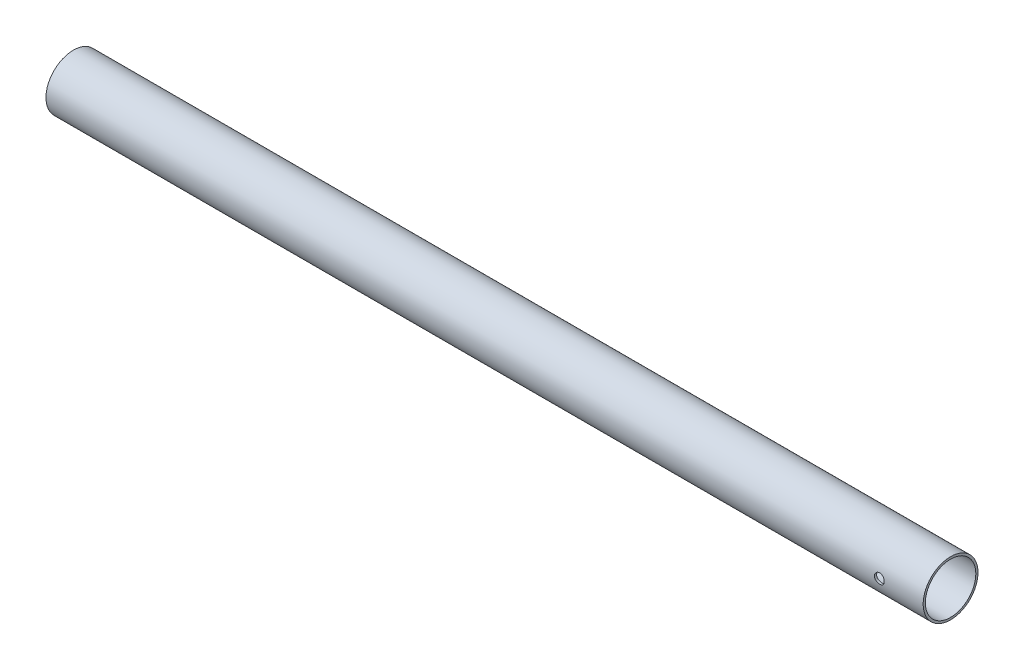
ISO-10303-21;
HEADER;
FILE_DESCRIPTION(('STEP AP214'),'2;1');
FILE_NAME('part.step','',(''),(''),'','','');
FILE_SCHEMA(('AUTOMOTIVE_DESIGN { 1 0 10303 214 1 1 1 1 }'));
ENDSEC;
DATA;
#1=APPLICATION_CONTEXT('core data for automotive mechanical design processes');
#2=APPLICATION_PROTOCOL_DEFINITION('international standard','automotive_design',2000,#1);
#3=PRODUCT_CONTEXT('',#1,'mechanical');
#4=PRODUCT('Part','Part','',(#3));
#5=PRODUCT_RELATED_PRODUCT_CATEGORY('part','',(#4));
#6=PRODUCT_DEFINITION_FORMATION('','',#4);
#7=PRODUCT_DEFINITION_CONTEXT('part definition',#1,'design');
#8=PRODUCT_DEFINITION('design','',#6,#7);
#9=PRODUCT_DEFINITION_SHAPE('','',#8);
#10=(LENGTH_UNIT() NAMED_UNIT(*) SI_UNIT(.MILLI.,.METRE.));
#11=(NAMED_UNIT(*) PLANE_ANGLE_UNIT() SI_UNIT($,.RADIAN.));
#12=(NAMED_UNIT(*) SI_UNIT($,.STERADIAN.) SOLID_ANGLE_UNIT());
#13=UNCERTAINTY_MEASURE_WITH_UNIT(LENGTH_MEASURE(1.E-05),#10,'distance_accuracy_value','');
#14=(GEOMETRIC_REPRESENTATION_CONTEXT(3) GLOBAL_UNCERTAINTY_ASSIGNED_CONTEXT((#13)) GLOBAL_UNIT_ASSIGNED_CONTEXT((#10,
#11,#12)) REPRESENTATION_CONTEXT('',''));
#15=CARTESIAN_POINT('',(0.,0.,0.));
#16=DIRECTION('',(0.,0.,1.));
#17=DIRECTION('',(1.,0.,0.));
#18=AXIS2_PLACEMENT_3D('',#15,#16,#17);
#19=CARTESIAN_POINT('',(400.,0.,0.));
#20=DIRECTION('',(1.,0.,0.));
#21=DIRECTION('',(0.,0.,-1.));
#22=AXIS2_PLACEMENT_3D('',#19,#20,#21);
#23=PLANE('',#22);
#24=CARTESIAN_POINT('',(400.,0.,0.));
#25=DIRECTION('',(1.,0.,0.));
#26=DIRECTION('',(0.,0.,-1.));
#27=AXIS2_PLACEMENT_3D('',#24,#25,#26);
#28=CIRCLE('',#27,12.5);
#29=CARTESIAN_POINT('',(400.,0.,-12.5));
#30=VERTEX_POINT('',#29);
#31=EDGE_CURVE('E51',#30,#30,#28,.T.);
#32=ORIENTED_EDGE('',*,*,#31,.T.);
#33=EDGE_LOOP('',(#32));
#34=FACE_BOUND('',#33,.T.);
#35=CARTESIAN_POINT('',(400.,0.,0.));
#36=DIRECTION('',(1.,0.,0.));
#37=DIRECTION('',(0.,0.,-1.));
#38=AXIS2_PLACEMENT_3D('',#35,#36,#37);
#39=CIRCLE('',#38,11.5);
#40=CARTESIAN_POINT('',(400.,0.,-11.5));
#41=VERTEX_POINT('',#40);
#42=EDGE_CURVE('E87',#41,#41,#39,.T.);
#43=ORIENTED_EDGE('',*,*,#42,.F.);
#44=EDGE_LOOP('',(#43));
#45=FACE_BOUND('',#44,.T.);
#46=ADVANCED_FACE('F35',(#34,#45),#23,.T.);
#47=CARTESIAN_POINT('',(0.,0.,0.));
#48=DIRECTION('',(1.,0.,0.));
#49=DIRECTION('',(0.,0.,-1.));
#50=AXIS2_PLACEMENT_3D('',#47,#48,#49);
#51=PLANE('',#50);
#52=CARTESIAN_POINT('',(0.,0.,0.));
#53=DIRECTION('',(1.,0.,0.));
#54=DIRECTION('',(0.,0.,-1.));
#55=AXIS2_PLACEMENT_3D('',#52,#53,#54);
#56=CIRCLE('',#55,12.5);
#57=CARTESIAN_POINT('',(0.,0.,-12.5));
#58=VERTEX_POINT('',#57);
#59=EDGE_CURVE('E55',#58,#58,#56,.T.);
#60=ORIENTED_EDGE('',*,*,#59,.F.);
#61=EDGE_LOOP('',(#60));
#62=FACE_BOUND('',#61,.T.);
#63=CARTESIAN_POINT('',(0.,0.,0.));
#64=DIRECTION('',(1.,0.,0.));
#65=DIRECTION('',(0.,0.,-1.));
#66=AXIS2_PLACEMENT_3D('',#63,#64,#65);
#67=CIRCLE('',#66,11.5);
#68=CARTESIAN_POINT('',(0.,0.,-11.5));
#69=VERTEX_POINT('',#68);
#70=EDGE_CURVE('E86',#69,#69,#67,.T.);
#71=ORIENTED_EDGE('',*,*,#70,.T.);
#72=EDGE_LOOP('',(#71));
#73=FACE_BOUND('',#72,.T.);
#74=ADVANCED_FACE('F93',(#62,#73),#51,.F.);
#75=CARTESIAN_POINT('',(400.,0.,0.));
#76=DIRECTION('',(-1.,0.,0.));
#77=DIRECTION('',(0.,0.,1.));
#78=AXIS2_PLACEMENT_3D('',#75,#76,#77);
#79=CYLINDRICAL_SURFACE('',#78,12.5);
#80=CARTESIAN_POINT('',(377.75,0.,12.5));
#81=CARTESIAN_POINT('',(377.750004881026,0.125298681986797,12.4999977674912));
#82=CARTESIAN_POINT('',(377.760501872311,0.25066193845859,12.4980965123329));
#83=CARTESIAN_POINT('',(377.802189035155,0.497861978665398,12.4906952154093));
#84=CARTESIAN_POINT('',(377.833397255,0.61969558985192,12.4851920348931));
#85=CARTESIAN_POINT('',(377.915525418449,0.856224998081099,12.4712031058359));
#86=CARTESIAN_POINT('',(377.966428182124,0.970926915296232,12.4627199573701));
#87=CARTESIAN_POINT('',(378.086453098236,1.19015008759337,12.4436998211695));
#88=CARTESIAN_POINT('',(378.155573550489,1.2946722914612,12.4331630251171));
#89=CARTESIAN_POINT('',(378.310885156238,1.49173892052009,12.4110699839934));
#90=CARTESIAN_POINT('',(378.397238838549,1.58415425002094,12.3995046634254));
#91=CARTESIAN_POINT('',(378.584215919306,1.75326760244445,12.3767261918013));
#92=CARTESIAN_POINT('',(378.684840293998,1.82996454920803,12.3655130649026));
#93=CARTESIAN_POINT('',(378.898405310083,1.96599369496261,12.3446205144066));
#94=CARTESIAN_POINT('',(379.011429978869,2.02519592811085,12.3349528032239));
#95=CARTESIAN_POINT('',(379.246023631375,2.12372345891957,12.3183728941507));
#96=CARTESIAN_POINT('',(379.367591937552,2.16305033075057,12.3114604780441));
#97=CARTESIAN_POINT('',(379.614445307403,2.22029926603348,12.3012648124572));
#98=CARTESIAN_POINT('',(379.739676747985,2.23844564821779,12.2979435578795));
#99=CARTESIAN_POINT('',(379.991447497663,2.25351448396807,12.2951915456139));
#100=CARTESIAN_POINT('',(380.117986697894,2.25043869020338,12.2957604666492));
#101=CARTESIAN_POINT('',(380.367164785449,2.22333268298985,12.3006898852657));
#102=CARTESIAN_POINT('',(380.489832336658,2.19955638565589,12.3050044364384));
#103=CARTESIAN_POINT('',(380.729408435276,2.13212365102783,12.316866899555));
#104=CARTESIAN_POINT('',(380.846316755245,2.08846642930113,12.3244149390804));
#105=CARTESIAN_POINT('',(381.071805143122,1.98225941180058,12.3419425352291));
#106=CARTESIAN_POINT('',(381.180335335255,1.9196060058232,12.3519353671767));
#107=CARTESIAN_POINT('',(381.385438003142,1.77725850028801,12.3732176723876));
#108=CARTESIAN_POINT('',(381.482009356283,1.69756280282898,12.3845072671906));
#109=CARTESIAN_POINT('',(381.661921136897,1.52201857930322,12.4073118839222));
#110=CARTESIAN_POINT('',(381.745049436327,1.42595261440166,12.4188278010628));
#111=CARTESIAN_POINT('',(381.894040903348,1.22112530278979,12.4406367648775));
#112=CARTESIAN_POINT('',(381.959903922596,1.11236384701144,12.4509298010443));
#113=CARTESIAN_POINT('',(382.072521985629,0.885019768870827,12.4691516328429));
#114=CARTESIAN_POINT('',(382.119256208455,0.766426612967708,12.4770778497592));
#115=CARTESIAN_POINT('',(382.192082193012,0.522899253039724,12.4896527895691));
#116=CARTESIAN_POINT('',(382.218175973129,0.39796567030335,12.4943018329256));
#117=CARTESIAN_POINT('',(382.248687979903,0.147130108494353,12.4997549324063));
#118=CARTESIAN_POINT('',(382.25339706021,0.0212645934313532,12.5006105787524));
#119=CARTESIAN_POINT('',(382.241784403972,-0.229455861704506,12.4985225341363));
#120=CARTESIAN_POINT('',(382.225463616601,-0.354310847131248,12.4955790146477));
#121=CARTESIAN_POINT('',(382.172496383332,-0.598552524626915,12.4862554255897));
#122=CARTESIAN_POINT('',(382.135995926579,-0.717971900974097,12.4799000484474));
#123=CARTESIAN_POINT('',(382.04386257153,-0.948996285923227,12.4644623821362));
#124=CARTESIAN_POINT('',(381.988228455274,-1.06060079652311,12.4553799193784));
#125=CARTESIAN_POINT('',(381.858754950924,-1.27407696942464,12.4353669796939));
#126=CARTESIAN_POINT('',(381.784736359436,-1.37583823911222,12.4244186663665));
#127=CARTESIAN_POINT('',(381.620838998827,-1.56559958610649,12.4019371582137));
#128=CARTESIAN_POINT('',(381.530958872466,-1.65359848457808,12.3904039133971));
#129=CARTESIAN_POINT('',(381.336577500913,-1.8144322861375,12.3678828600073));
#130=CARTESIAN_POINT('',(381.231911488777,-1.88706941512662,12.3569034068723));
#131=CARTESIAN_POINT('',(381.011692349073,-2.01373073598649,12.3368965881738));
#132=CARTESIAN_POINT('',(380.896139605745,-2.06775558445176,12.327869153752));
#133=CARTESIAN_POINT('',(380.65794816388,-2.15537258854328,12.3128530018575));
#134=CARTESIAN_POINT('',(380.535344792256,-2.18905829167568,12.3068503934841));
#135=CARTESIAN_POINT('',(380.286101320987,-2.23533164183898,12.2985305984642));
#136=CARTESIAN_POINT('',(380.159461638613,-2.24792146258463,12.2962130321129));
#137=CARTESIAN_POINT('',(379.907719026291,-2.25157741279498,12.2955439189313));
#138=CARTESIAN_POINT('',(379.782620668345,-2.24295524222451,12.2971349368514));
#139=CARTESIAN_POINT('',(379.535686889202,-2.20511123815906,12.3039769205597));
#140=CARTESIAN_POINT('',(379.413851452036,-2.17588950549702,12.3092278684327));
#141=CARTESIAN_POINT('',(379.177052107882,-2.09780295588624,12.3227747458695));
#142=CARTESIAN_POINT('',(379.062077622884,-2.0489693244615,12.331065839386));
#143=CARTESIAN_POINT('',(378.841903383332,-1.9330784374378,12.3497626645301));
#144=CARTESIAN_POINT('',(378.736704244324,-1.86602003528115,12.3601685291918));
#145=CARTESIAN_POINT('',(378.537500445622,-1.71448870972005,12.3821021382439));
#146=CARTESIAN_POINT('',(378.443670525958,-1.6297879913884,12.3936433960265));
#147=CARTESIAN_POINT('',(378.271450700472,-1.44585363976477,12.4164438377711));
#148=CARTESIAN_POINT('',(378.193064350056,-1.34661666909395,12.4277029562598));
#149=CARTESIAN_POINT('',(378.05336059235,-1.13545412119437,12.4487784100862));
#150=CARTESIAN_POINT('',(377.992188444119,-1.02343115620965,12.4585821554973));
#151=CARTESIAN_POINT('',(377.889628594984,-0.790561442189736,12.4755196121995));
#152=CARTESIAN_POINT('',(377.848221889639,-0.669723298367009,12.4826558868212));
#153=CARTESIAN_POINT('',(377.794993612026,-0.457071330933689,12.4919609434263));
#154=CARTESIAN_POINT('',(377.778149156143,-0.366517696899414,12.4949589083512));
#155=CARTESIAN_POINT('',(377.755650681845,-0.183987628103353,12.4989792344744));
#156=CARTESIAN_POINT('',(377.749996415691,-0.0920112248856671,12.5000016394097));
#157=CARTESIAN_POINT('',(377.75,0.,12.5));
#158=B_SPLINE_CURVE_WITH_KNOTS('',3,(#80,#81,#82,#83,#84,#85,#86,#87,#88,#89,#90,#91,#92,#93,
#94,#95,#96,#97,#98,#99,#100,#101,#102,#103,#104,#105,#106,#107,#108,#109,#110,#111,#112,#113,
#114,#115,#116,#117,#118,#119,#120,#121,#122,#123,#124,#125,#126,#127,#128,#129,#130,#131,#132,
#133,#134,#135,#136,#137,#138,#139,#140,#141,#142,#143,#144,#145,#146,#147,#148,#149,#150,#151,
#152,#153,#154,#155,#156,#157),.UNSPECIFIED.,.T.,.F.,(4,2,2,2,2,2,2,2,2,2,2,2,2,2,2,2,2,2,2,2,2,
2,2,2,2,2,2,2,2,2,2,2,2,2,2,2,2,2,4),(0.,0.375559617107249,0.751446936801127,1.12700709938377,
1.50253222484551,1.88178230491347,2.26105834167071,2.64308495155377,3.02508129938024,
3.4029941907251,3.78087587186719,4.15418667058527,4.52751220013432,4.90291173817364,
5.27834648947029,5.65922447074247,6.04010572441035,6.42140045723418,6.8026578994535,
7.17871401103883,7.55475315008814,7.92810678591757,8.30148419208372,8.67865469057383,
9.05585747845508,9.43765507111856,9.81943919354212,10.1994536967026,10.5794290408499,
10.9538542714616,11.3282776693095,11.7021080267959,12.0759619081628,12.454980861875,
12.8340869713551,13.2163022265236,13.5981492383499,13.8739419673181,14.149728590447),.UNSPECIFIED.);
#159=CARTESIAN_POINT('',(377.75,0.,12.5));
#160=VERTEX_POINT('',#159);
#161=EDGE_CURVE('E10',#160,#160,#158,.T.);
#162=ORIENTED_EDGE('',*,*,#161,.T.);
#163=EDGE_LOOP('',(#162));
#164=FACE_BOUND('',#163,.T.);
#165=CARTESIAN_POINT('',(377.75,0.,-12.5));
#166=CARTESIAN_POINT('',(377.750004881026,-0.125298681986797,-12.4999977674912));
#167=CARTESIAN_POINT('',(377.760501872311,-0.25066193845859,-12.4980965123329));
#168=CARTESIAN_POINT('',(377.802189035155,-0.497861978665398,-12.4906952154093));
#169=CARTESIAN_POINT('',(377.833397255,-0.61969558985192,-12.4851920348931));
#170=CARTESIAN_POINT('',(377.915525418449,-0.856224998081099,-12.4712031058359));
#171=CARTESIAN_POINT('',(377.966428182124,-0.970926915296232,-12.4627199573701));
#172=CARTESIAN_POINT('',(378.086453098236,-1.19015008759337,-12.4436998211695));
#173=CARTESIAN_POINT('',(378.155573550489,-1.2946722914612,-12.4331630251171));
#174=CARTESIAN_POINT('',(378.310885156238,-1.49173892052009,-12.4110699839934));
#175=CARTESIAN_POINT('',(378.397238838549,-1.58415425002094,-12.3995046634254));
#176=CARTESIAN_POINT('',(378.584215919306,-1.75326760244445,-12.3767261918013));
#177=CARTESIAN_POINT('',(378.684840293998,-1.82996454920803,-12.3655130649026));
#178=CARTESIAN_POINT('',(378.898405310083,-1.96599369496261,-12.3446205144066));
#179=CARTESIAN_POINT('',(379.011429978869,-2.02519592811085,-12.3349528032239));
#180=CARTESIAN_POINT('',(379.246023631375,-2.12372345891957,-12.3183728941507));
#181=CARTESIAN_POINT('',(379.367591937552,-2.16305033075057,-12.3114604780441));
#182=CARTESIAN_POINT('',(379.614445307403,-2.22029926603348,-12.3012648124572));
#183=CARTESIAN_POINT('',(379.739676747985,-2.23844564821779,-12.2979435578795));
#184=CARTESIAN_POINT('',(379.991447497663,-2.25351448396807,-12.2951915456139));
#185=CARTESIAN_POINT('',(380.117986697894,-2.25043869020338,-12.2957604666492));
#186=CARTESIAN_POINT('',(380.367164785449,-2.22333268298985,-12.3006898852657));
#187=CARTESIAN_POINT('',(380.489832336658,-2.19955638565589,-12.3050044364384));
#188=CARTESIAN_POINT('',(380.729408435276,-2.13212365102783,-12.316866899555));
#189=CARTESIAN_POINT('',(380.846316755245,-2.08846642930113,-12.3244149390804));
#190=CARTESIAN_POINT('',(381.071805143122,-1.98225941180058,-12.3419425352291));
#191=CARTESIAN_POINT('',(381.180335335255,-1.9196060058232,-12.3519353671767));
#192=CARTESIAN_POINT('',(381.385438003142,-1.77725850028801,-12.3732176723876));
#193=CARTESIAN_POINT('',(381.482009356283,-1.69756280282898,-12.3845072671906));
#194=CARTESIAN_POINT('',(381.661921136897,-1.52201857930322,-12.4073118839222));
#195=CARTESIAN_POINT('',(381.745049436327,-1.42595261440166,-12.4188278010628));
#196=CARTESIAN_POINT('',(381.894040903348,-1.22112530278979,-12.4406367648775));
#197=CARTESIAN_POINT('',(381.959903922596,-1.11236384701144,-12.4509298010443));
#198=CARTESIAN_POINT('',(382.072521985629,-0.885019768870827,-12.4691516328429));
#199=CARTESIAN_POINT('',(382.119256208455,-0.766426612967708,-12.4770778497592));
#200=CARTESIAN_POINT('',(382.192082193012,-0.522899253039724,-12.4896527895691));
#201=CARTESIAN_POINT('',(382.218175973129,-0.39796567030335,-12.4943018329256));
#202=CARTESIAN_POINT('',(382.248687979903,-0.147130108494353,-12.4997549324063));
#203=CARTESIAN_POINT('',(382.25339706021,-0.0212645934313519,-12.5006105787524));
#204=CARTESIAN_POINT('',(382.241784403972,0.229455861704507,-12.4985225341363));
#205=CARTESIAN_POINT('',(382.225463616601,0.354310847131248,-12.4955790146477));
#206=CARTESIAN_POINT('',(382.172496383332,0.598552524626914,-12.4862554255897));
#207=CARTESIAN_POINT('',(382.135995926579,0.717971900974096,-12.4799000484474));
#208=CARTESIAN_POINT('',(382.04386257153,0.948996285923226,-12.4644623821362));
#209=CARTESIAN_POINT('',(381.988228455274,1.06060079652311,-12.4553799193784));
#210=CARTESIAN_POINT('',(381.858754950924,1.27407696942464,-12.4353669796939));
#211=CARTESIAN_POINT('',(381.784736359436,1.37583823911222,-12.4244186663665));
#212=CARTESIAN_POINT('',(381.620838998827,1.56559958610649,-12.4019371582137));
#213=CARTESIAN_POINT('',(381.530958872466,1.65359848457808,-12.3904039133971));
#214=CARTESIAN_POINT('',(381.336577500913,1.8144322861375,-12.3678828600073));
#215=CARTESIAN_POINT('',(381.231911488777,1.88706941512662,-12.3569034068723));
#216=CARTESIAN_POINT('',(381.011692349073,2.01373073598649,-12.3368965881738));
#217=CARTESIAN_POINT('',(380.896139605745,2.06775558445176,-12.327869153752));
#218=CARTESIAN_POINT('',(380.65794816388,2.15537258854328,-12.3128530018575));
#219=CARTESIAN_POINT('',(380.535344792256,2.18905829167568,-12.3068503934841));
#220=CARTESIAN_POINT('',(380.286101320987,2.23533164183898,-12.2985305984642));
#221=CARTESIAN_POINT('',(380.159461638613,2.24792146258463,-12.2962130321129));
#222=CARTESIAN_POINT('',(379.907719026291,2.25157741279498,-12.2955439189313));
#223=CARTESIAN_POINT('',(379.782620668345,2.24295524222451,-12.2971349368514));
#224=CARTESIAN_POINT('',(379.535686889202,2.20511123815908,-12.3039769205597));
#225=CARTESIAN_POINT('',(379.413851452036,2.17588950549703,-12.3092278684327));
#226=CARTESIAN_POINT('',(379.177052107882,2.09780295588624,-12.3227747458695));
#227=CARTESIAN_POINT('',(379.062077622884,2.0489693244615,-12.331065839386));
#228=CARTESIAN_POINT('',(378.841903383332,1.9330784374378,-12.3497626645301));
#229=CARTESIAN_POINT('',(378.736704244324,1.86602003528115,-12.3601685291918));
#230=CARTESIAN_POINT('',(378.537500445622,1.71448870972005,-12.3821021382439));
#231=CARTESIAN_POINT('',(378.443670525958,1.6297879913884,-12.3936433960265));
#232=CARTESIAN_POINT('',(378.271450700472,1.44585363976477,-12.4164438377711));
#233=CARTESIAN_POINT('',(378.193064350056,1.34661666909395,-12.4277029562598));
#234=CARTESIAN_POINT('',(378.05336059235,1.13545412119435,-12.4487784100862));
#235=CARTESIAN_POINT('',(377.992188444119,1.02343115620963,-12.4585821554973));
#236=CARTESIAN_POINT('',(377.889628594984,0.790561442189713,-12.4755196121995));
#237=CARTESIAN_POINT('',(377.848221889639,0.669723298366994,-12.4826558868212));
#238=CARTESIAN_POINT('',(377.794993612026,0.457071330933687,-12.4919609434263));
#239=CARTESIAN_POINT('',(377.778149156143,0.366517696899413,-12.4949589083512));
#240=CARTESIAN_POINT('',(377.755650681845,0.183987628103352,-12.4989792344744));
#241=CARTESIAN_POINT('',(377.749996415691,0.0920112248856668,-12.5000016394097));
#242=CARTESIAN_POINT('',(377.75,0.,-12.5));
#243=B_SPLINE_CURVE_WITH_KNOTS('',3,(#165,#166,#167,#168,#169,#170,#171,#172,#173,#174,#175,
#176,#177,#178,#179,#180,#181,#182,#183,#184,#185,#186,#187,#188,#189,#190,#191,#192,#193,#194,
#195,#196,#197,#198,#199,#200,#201,#202,#203,#204,#205,#206,#207,#208,#209,#210,#211,#212,#213,
#214,#215,#216,#217,#218,#219,#220,#221,#222,#223,#224,#225,#226,#227,#228,#229,#230,#231,#232,
#233,#234,#235,#236,#237,#238,#239,#240,#241,#242),.UNSPECIFIED.,.T.,.F.,(4,2,2,2,2,2,2,2,2,2,2,
2,2,2,2,2,2,2,2,2,2,2,2,2,2,2,2,2,2,2,2,2,2,2,2,2,2,2,4),(0.,0.375559617107249,
0.751446936801127,1.12700709938377,1.50253222484551,1.88178230491347,2.26105834167071,
2.64308495155377,3.02508129938024,3.4029941907251,3.78087587186719,4.15418667058527,
4.52751220013432,4.90291173817364,5.27834648947029,5.65922447074247,6.04010572441035,
6.42140045723418,6.8026578994535,7.17871401103883,7.55475315008814,7.92810678591757,
8.30148419208372,8.67865469057383,9.05585747845508,9.43765507111856,9.81943919354213,
10.1994536967026,10.5794290408499,10.9538542714615,11.3282776693095,11.7021080267959,
12.0759619081628,12.454980861875,12.8340869713551,13.2163022265237,13.5981492383499,
13.8739419673181,14.149728590447),.UNSPECIFIED.);
#244=CARTESIAN_POINT('',(377.75,0.,-12.5));
#245=VERTEX_POINT('',#244);
#246=EDGE_CURVE('E47',#245,#245,#243,.T.);
#247=ORIENTED_EDGE('',*,*,#246,.T.);
#248=EDGE_LOOP('',(#247));
#249=FACE_BOUND('',#248,.T.);
#250=ORIENTED_EDGE('',*,*,#31,.F.);
#251=EDGE_LOOP('',(#250));
#252=FACE_BOUND('',#251,.T.);
#253=ORIENTED_EDGE('',*,*,#59,.T.);
#254=EDGE_LOOP('',(#253));
#255=FACE_BOUND('',#254,.T.);
#256=ADVANCED_FACE('F37',(#164,#249,#252,#255),#79,.T.);
#257=CARTESIAN_POINT('',(400.,0.,0.));
#258=DIRECTION('',(-1.,0.,0.));
#259=DIRECTION('',(0.,0.,1.));
#260=AXIS2_PLACEMENT_3D('',#257,#258,#259);
#261=CYLINDRICAL_SURFACE('',#260,11.5);
#262=CARTESIAN_POINT('',(382.25,0.,11.5));
#263=CARTESIAN_POINT('',(382.24999533231,-0.125104648396382,11.4999977052023));
#264=CARTESIAN_POINT('',(382.239530628245,-0.250268907298439,11.4979375455785));
#265=CARTESIAN_POINT('',(382.197979312871,-0.497063385151349,11.4899178242548));
#266=CARTESIAN_POINT('',(382.166875956151,-0.61869065060746,11.4839550962146));
#267=CARTESIAN_POINT('',(382.085041850355,-0.854806884509491,11.4687964821032));
#268=CARTESIAN_POINT('',(382.034329521378,-0.969302435430592,11.4596036310536));
#269=CARTESIAN_POINT('',(381.914770886851,-1.18815114812752,11.4389857148646));
#270=CARTESIAN_POINT('',(381.845925798149,-1.29250498984762,11.4275607995275));
#271=CARTESIAN_POINT('',(381.691107519665,-1.48947225401675,11.4035715479183));
#272=CARTESIAN_POINT('',(381.604944367211,-1.58193495271135,11.3909955012802));
#273=CARTESIAN_POINT('',(381.418344275291,-1.75119057513039,11.3662071876974));
#274=CARTESIAN_POINT('',(381.317906254451,-1.82798231064818,11.3539949483973));
#275=CARTESIAN_POINT('',(381.104530044616,-1.96435252739131,11.3312028054777));
#276=CARTESIAN_POINT('',(380.991490980274,-2.02377591339396,11.320637980538));
#277=CARTESIAN_POINT('',(380.756792356111,-2.12272928694864,11.3025027086903));
#278=CARTESIAN_POINT('',(380.6351336105,-2.16226115058992,11.2949319794056));
#279=CARTESIAN_POINT('',(380.388267588741,-2.21982197948066,11.2837603511891));
#280=CARTESIAN_POINT('',(380.263124089492,-2.23811483219321,11.2801107767715));
#281=CARTESIAN_POINT('',(380.011495079979,-2.25349783057741,11.2770480811339));
#282=CARTESIAN_POINT('',(379.885009702131,-2.25059004924259,11.2776345457148));
#283=CARTESIAN_POINT('',(379.636211345055,-2.22386789727953,11.2829334072917));
#284=CARTESIAN_POINT('',(379.513864511706,-2.20035516817222,11.2875862724731));
#285=CARTESIAN_POINT('',(379.274886266696,-2.13356630358797,11.3004000189991));
#286=CARTESIAN_POINT('',(379.15825511763,-2.09028926102037,11.3085610613518));
#287=CARTESIAN_POINT('',(378.933144965491,-1.98490975529853,11.3275329679932));
#288=CARTESIAN_POINT('',(378.824723781415,-1.92268693978435,11.3383606856335));
#289=CARTESIAN_POINT('',(378.619748077981,-1.78126715325841,11.3614349980654));
#290=CARTESIAN_POINT('',(378.523194867849,-1.70206831215963,11.3736817491101));
#291=CARTESIAN_POINT('',(378.342954553623,-1.52732560341027,11.3984726633968));
#292=CARTESIAN_POINT('',(378.259517242167,-1.43152408928663,11.4110183195754));
#293=CARTESIAN_POINT('',(378.109858571978,-1.22715378158969,11.4348003784541));
#294=CARTESIAN_POINT('',(378.043637416224,-1.11858483750905,11.4460367657171));
#295=CARTESIAN_POINT('',(377.930247971727,-0.891490075740268,11.4659600661496));
#296=CARTESIAN_POINT('',(377.883107323573,-0.772950111633734,11.4746432757681));
#297=CARTESIAN_POINT('',(377.809478474295,-0.529425752807433,11.4884535779699));
#298=CARTESIAN_POINT('',(377.782987880898,-0.404442106366078,11.4935810824677));
#299=CARTESIAN_POINT('',(377.751762643429,-0.153725653815772,11.4996451564532));
#300=CARTESIAN_POINT('',(377.746686010398,-0.0280369835981394,11.5006475983319));
#301=CARTESIAN_POINT('',(377.757513082769,0.222392858952598,11.4985312086144));
#302=CARTESIAN_POINT('',(377.773415661712,0.347134081796333,11.4954125982942));
#303=CARTESIAN_POINT('',(377.825465541075,0.591031379765674,11.4854456638769));
#304=CARTESIAN_POINT('',(377.861438227579,0.710226149379412,11.478629523012));
#305=CARTESIAN_POINT('',(377.952417036676,0.940892335717169,11.4620288754017));
#306=CARTESIAN_POINT('',(378.007424538931,1.05236319190139,11.4522441534971));
#307=CARTESIAN_POINT('',(378.135657410539,1.26586572005976,11.4306275328851));
#308=CARTESIAN_POINT('',(378.209089766431,1.36777072027957,11.41877287481));
#309=CARTESIAN_POINT('',(378.371809682904,1.55793456649565,11.3943866736405));
#310=CARTESIAN_POINT('',(378.461098865198,1.64619201499757,11.3818550614038));
#311=CARTESIAN_POINT('',(378.654551694914,1.80786813845913,11.3573065398749));
#312=CARTESIAN_POINT('',(378.758912654849,1.88105252011471,11.3452997575749));
#313=CARTESIAN_POINT('',(378.978647487386,2.00885312015111,11.3233710045787));
#314=CARTESIAN_POINT('',(379.094020929493,2.06347006398005,11.3134489524358));
#315=CARTESIAN_POINT('',(379.331936271208,2.15226115510639,11.2968940391648));
#316=CARTESIAN_POINT('',(379.454438332147,2.18653880375029,11.2902445548396));
#317=CARTESIAN_POINT('',(379.703606562397,2.23399415071165,11.280951435738));
#318=CARTESIAN_POINT('',(379.830272212922,2.24717446767718,11.2783073038103));
#319=CARTESIAN_POINT('',(380.081821696952,2.25196737012561,11.2773510287918));
#320=CARTESIAN_POINT('',(380.206698346422,2.24394994046628,11.2789645713932));
#321=CARTESIAN_POINT('',(380.453286521867,2.2073891809265,11.2861762450152));
#322=CARTESIAN_POINT('',(380.574998070874,2.17884600044049,11.2917743470345));
#323=CARTESIAN_POINT('',(380.811578586149,2.10220588414542,11.3062918274851));
#324=CARTESIAN_POINT('',(380.926462124576,2.05415244047018,11.3152038149333));
#325=CARTESIAN_POINT('',(381.146594636933,1.93989759227758,11.3353494752653));
#326=CARTESIAN_POINT('',(381.251842846741,1.87369475009557,11.3465833320535));
#327=CARTESIAN_POINT('',(381.451563335777,1.72374865725851,11.3703355151987));
#328=CARTESIAN_POINT('',(381.545832357956,1.63973747078958,11.3828717707938));
#329=CARTESIAN_POINT('',(381.719057684867,1.45711464204481,11.4076856375573));
#330=CARTESIAN_POINT('',(381.798010467148,1.35849965033817,11.4199631886511));
#331=CARTESIAN_POINT('',(381.939100396728,1.14829192575653,11.4430199252586));
#332=CARTESIAN_POINT('',(382.001062624601,1.03657995491226,11.4537830066822));
#333=CARTESIAN_POINT('',(382.105238001861,0.804152292916161,11.4724400772488));
#334=CARTESIAN_POINT('',(382.147469218958,0.683444956760195,11.4803366897367));
#335=CARTESIAN_POINT('',(382.202663891523,0.468696802190496,11.4908100003159));
#336=CARTESIAN_POINT('',(382.220383753002,0.375890515966649,11.4942363338732));
#337=CARTESIAN_POINT('',(382.244053394506,0.18873409914546,11.4988321660955));
#338=CARTESIAN_POINT('',(382.250003521494,0.0943840141407244,11.5000017312883));
#339=CARTESIAN_POINT('',(382.25,0.,11.5));
#340=B_SPLINE_CURVE_WITH_KNOTS('',3,(#262,#263,#264,#265,#266,#267,#268,#269,#270,#271,#272,
#273,#274,#275,#276,#277,#278,#279,#280,#281,#282,#283,#284,#285,#286,#287,#288,#289,#290,#291,
#292,#293,#294,#295,#296,#297,#298,#299,#300,#301,#302,#303,#304,#305,#306,#307,#308,#309,#310,
#311,#312,#313,#314,#315,#316,#317,#318,#319,#320,#321,#322,#323,#324,#325,#326,#327,#328,#329,
#330,#331,#332,#333,#334,#335,#336,#337,#338,#339),.UNSPECIFIED.,.T.,.F.,(4,2,2,2,2,2,2,2,2,2,2,
2,2,2,2,2,2,2,2,2,2,2,2,2,2,2,2,2,2,2,2,2,2,2,2,2,2,2,4),(0.,0.374968701922706,
0.750242011669612,1.12516365362254,1.50006014183321,1.87931847818886,2.25860556006465,
2.64118277804862,3.0237239061046,3.40145943437852,3.77915802824741,4.15141805606958,
4.52369517062426,4.89838832724107,5.27312278146593,5.65430107817007,6.03548386880025,
6.41721689266253,6.79890568684543,7.17447513082651,7.55002440976851,7.92235617055595,
8.29471492396247,8.67146035765452,9.04824434415619,9.43050414794536,9.81274901474958,
10.1930316744191,10.5732671288917,10.946909959922,11.3205500714612,11.6933618007362,
12.0662030700089,12.4451123596599,12.8241086883835,13.2068716468152,13.5892834184603,
13.8721833351616,14.1550749120794),.UNSPECIFIED.);
#341=CARTESIAN_POINT('',(382.25,0.,11.5));
#342=VERTEX_POINT('',#341);
#343=EDGE_CURVE('E80',#342,#342,#340,.T.);
#344=ORIENTED_EDGE('',*,*,#343,.F.);
#345=EDGE_LOOP('',(#344));
#346=FACE_BOUND('',#345,.T.);
#347=CARTESIAN_POINT('',(377.75,0.,-11.5));
#348=CARTESIAN_POINT('',(377.75000466769,-0.125104648396382,-11.4999977052023));
#349=CARTESIAN_POINT('',(377.760469371755,-0.250268907298439,-11.4979375455785));
#350=CARTESIAN_POINT('',(377.802020687129,-0.497063385151349,-11.4899178242548));
#351=CARTESIAN_POINT('',(377.833124043849,-0.61869065060746,-11.4839550962146));
#352=CARTESIAN_POINT('',(377.914958149645,-0.854806884509491,-11.4687964821032));
#353=CARTESIAN_POINT('',(377.965670478622,-0.969302435430592,-11.4596036310536));
#354=CARTESIAN_POINT('',(378.085229113149,-1.18815114812752,-11.4389857148646));
#355=CARTESIAN_POINT('',(378.154074201851,-1.29250498984762,-11.4275607995275));
#356=CARTESIAN_POINT('',(378.308892480335,-1.48947225401675,-11.4035715479183));
#357=CARTESIAN_POINT('',(378.395055632789,-1.58193495271135,-11.3909955012802));
#358=CARTESIAN_POINT('',(378.581655724709,-1.75119057513039,-11.3662071876974));
#359=CARTESIAN_POINT('',(378.682093745549,-1.82798231064818,-11.3539949483973));
#360=CARTESIAN_POINT('',(378.895469955384,-1.96435252739131,-11.3312028054777));
#361=CARTESIAN_POINT('',(379.008509019726,-2.02377591339396,-11.320637980538));
#362=CARTESIAN_POINT('',(379.243207643889,-2.12272928694864,-11.3025027086903));
#363=CARTESIAN_POINT('',(379.3648663895,-2.16226115058992,-11.2949319794056));
#364=CARTESIAN_POINT('',(379.611732411259,-2.21982197948066,-11.2837603511891));
#365=CARTESIAN_POINT('',(379.736875910508,-2.23811483219321,-11.2801107767715));
#366=CARTESIAN_POINT('',(379.988504920021,-2.25349783057741,-11.2770480811339));
#367=CARTESIAN_POINT('',(380.114990297869,-2.25059004924259,-11.2776345457148));
#368=CARTESIAN_POINT('',(380.363788654945,-2.22386789727953,-11.2829334072917));
#369=CARTESIAN_POINT('',(380.486135488294,-2.20035516817222,-11.2875862724731));
#370=CARTESIAN_POINT('',(380.725113733304,-2.13356630358797,-11.3004000189991));
#371=CARTESIAN_POINT('',(380.84174488237,-2.09028926102037,-11.3085610613518));
#372=CARTESIAN_POINT('',(381.066855034509,-1.98490975529853,-11.3275329679932));
#373=CARTESIAN_POINT('',(381.175276218585,-1.92268693978435,-11.3383606856335));
#374=CARTESIAN_POINT('',(381.380251922019,-1.78126715325841,-11.3614349980654));
#375=CARTESIAN_POINT('',(381.476805132151,-1.70206831215963,-11.3736817491101));
#376=CARTESIAN_POINT('',(381.657045446377,-1.52732560341027,-11.3984726633968));
#377=CARTESIAN_POINT('',(381.740482757833,-1.43152408928663,-11.4110183195754));
#378=CARTESIAN_POINT('',(381.890141428022,-1.22715378158969,-11.4348003784541));
#379=CARTESIAN_POINT('',(381.956362583776,-1.11858483750905,-11.4460367657171));
#380=CARTESIAN_POINT('',(382.069752028273,-0.891490075740268,-11.4659600661496));
#381=CARTESIAN_POINT('',(382.116892676427,-0.772950111633734,-11.4746432757681));
#382=CARTESIAN_POINT('',(382.190521525705,-0.529425752807433,-11.4884535779699));
#383=CARTESIAN_POINT('',(382.217012119102,-0.404442106366078,-11.4935810824677));
#384=CARTESIAN_POINT('',(382.248237356571,-0.153725653815773,-11.4996451564532));
#385=CARTESIAN_POINT('',(382.253313989602,-0.028036983598141,-11.5006475983319));
#386=CARTESIAN_POINT('',(382.242486917231,0.222392858952597,-11.4985312086144));
#387=CARTESIAN_POINT('',(382.226584338288,0.347134081796332,-11.4954125982942));
#388=CARTESIAN_POINT('',(382.174534458925,0.591031379765674,-11.4854456638769));
#389=CARTESIAN_POINT('',(382.138561772421,0.710226149379412,-11.478629523012));
#390=CARTESIAN_POINT('',(382.047582963324,0.940892335717169,-11.4620288754017));
#391=CARTESIAN_POINT('',(381.992575461069,1.05236319190139,-11.4522441534971));
#392=CARTESIAN_POINT('',(381.864342589461,1.26586572005976,-11.4306275328851));
#393=CARTESIAN_POINT('',(381.790910233569,1.36777072027957,-11.41877287481));
#394=CARTESIAN_POINT('',(381.628190317096,1.55793456649565,-11.3943866736405));
#395=CARTESIAN_POINT('',(381.538901134802,1.64619201499757,-11.3818550614038));
#396=CARTESIAN_POINT('',(381.345448305086,1.80786813845913,-11.3573065398749));
#397=CARTESIAN_POINT('',(381.241087345151,1.88105252011471,-11.3452997575749));
#398=CARTESIAN_POINT('',(381.021352512614,2.00885312015111,-11.3233710045787));
#399=CARTESIAN_POINT('',(380.905979070507,2.06347006398005,-11.3134489524358));
#400=CARTESIAN_POINT('',(380.668063728792,2.1522611551064,-11.2968940391648));
#401=CARTESIAN_POINT('',(380.545561667853,2.18653880375031,-11.2902445548396));
#402=CARTESIAN_POINT('',(380.296393437603,2.23399415071166,-11.280951435738));
#403=CARTESIAN_POINT('',(380.169727787078,2.24717446767718,-11.2783073038103));
#404=CARTESIAN_POINT('',(379.918178303048,2.25196737012561,-11.2773510287918));
#405=CARTESIAN_POINT('',(379.793301653578,2.24394994046628,-11.2789645713932));
#406=CARTESIAN_POINT('',(379.546713478133,2.20738918092648,-11.2861762450152));
#407=CARTESIAN_POINT('',(379.425001929126,2.17884600044047,-11.2917743470345));
#408=CARTESIAN_POINT('',(379.188421413851,2.10220588414542,-11.3062918274851));
#409=CARTESIAN_POINT('',(379.073537875424,2.05415244047018,-11.3152038149333));
#410=CARTESIAN_POINT('',(378.853405363067,1.93989759227758,-11.3353494752653));
#411=CARTESIAN_POINT('',(378.748157153259,1.87369475009557,-11.3465833320535));
#412=CARTESIAN_POINT('',(378.548436664223,1.72374865725851,-11.3703355151987));
#413=CARTESIAN_POINT('',(378.454167642044,1.63973747078958,-11.3828717707938));
#414=CARTESIAN_POINT('',(378.280942315133,1.45711464204481,-11.4076856375573));
#415=CARTESIAN_POINT('',(378.201989532852,1.35849965033817,-11.4199631886511));
#416=CARTESIAN_POINT('',(378.060899603272,1.14829192575653,-11.4430199252586));
#417=CARTESIAN_POINT('',(377.998937375399,1.03657995491226,-11.4537830066822));
#418=CARTESIAN_POINT('',(377.894761998139,0.804152292916161,-11.4724400772488));
#419=CARTESIAN_POINT('',(377.852530781042,0.683444956760195,-11.4803366897367));
#420=CARTESIAN_POINT('',(377.797336108477,0.468696802190496,-11.4908100003159));
#421=CARTESIAN_POINT('',(377.779616246998,0.375890515966649,-11.4942363338732));
#422=CARTESIAN_POINT('',(377.755946605494,0.18873409914546,-11.4988321660955));
#423=CARTESIAN_POINT('',(377.749996478506,0.0943840141407244,-11.5000017312883));
#424=CARTESIAN_POINT('',(377.75,0.,-11.5));
#425=B_SPLINE_CURVE_WITH_KNOTS('',3,(#347,#348,#349,#350,#351,#352,#353,#354,#355,#356,#357,
#358,#359,#360,#361,#362,#363,#364,#365,#366,#367,#368,#369,#370,#371,#372,#373,#374,#375,#376,
#377,#378,#379,#380,#381,#382,#383,#384,#385,#386,#387,#388,#389,#390,#391,#392,#393,#394,#395,
#396,#397,#398,#399,#400,#401,#402,#403,#404,#405,#406,#407,#408,#409,#410,#411,#412,#413,#414,
#415,#416,#417,#418,#419,#420,#421,#422,#423,#424),.UNSPECIFIED.,.T.,.F.,(4,2,2,2,2,2,2,2,2,2,2,
2,2,2,2,2,2,2,2,2,2,2,2,2,2,2,2,2,2,2,2,2,2,2,2,2,2,2,4),(0.,0.374968701922706,
0.750242011669612,1.12516365362254,1.50006014183321,1.87931847818886,2.25860556006465,
2.64118277804862,3.0237239061046,3.40145943437852,3.77915802824741,4.15141805606958,
4.52369517062426,4.89838832724107,5.27312278146593,5.65430107817007,6.03548386880025,
6.41721689266253,6.79890568684543,7.1744751308265,7.55002440976851,7.92235617055595,
8.29471492396247,8.67146035765452,9.04824434415619,9.43050414794536,9.81274901474958,
10.1930316744191,10.5732671288917,10.9469099599221,11.3205500714612,11.6933618007362,
12.0662030700089,12.4451123596599,12.8241086883835,13.2068716468152,13.5892834184603,
13.8721833351616,14.1550749120794),.UNSPECIFIED.);
#426=CARTESIAN_POINT('',(377.75,0.,-11.5));
#427=VERTEX_POINT('',#426);
#428=EDGE_CURVE('E75',#427,#427,#425,.T.);
#429=ORIENTED_EDGE('',*,*,#428,.F.);
#430=EDGE_LOOP('',(#429));
#431=FACE_BOUND('',#430,.T.);
#432=ORIENTED_EDGE('',*,*,#42,.T.);
#433=EDGE_LOOP('',(#432));
#434=FACE_BOUND('',#433,.T.);
#435=ORIENTED_EDGE('',*,*,#70,.F.);
#436=EDGE_LOOP('',(#435));
#437=FACE_BOUND('',#436,.T.);
#438=ADVANCED_FACE('F67',(#346,#431,#434,#437),#261,.F.);
#439=CARTESIAN_POINT('',(380.,0.,-12.5));
#440=DIRECTION('',(0.,0.,-1.));
#441=DIRECTION('',(-1.,0.,0.));
#442=AXIS2_PLACEMENT_3D('',#439,#440,#441);
#443=CYLINDRICAL_SURFACE('',#442,2.24999999999997);
#444=ORIENTED_EDGE('',*,*,#428,.T.);
#445=EDGE_LOOP('',(#444));
#446=FACE_BOUND('',#445,.T.);
#447=ORIENTED_EDGE('',*,*,#246,.F.);
#448=EDGE_LOOP('',(#447));
#449=FACE_BOUND('',#448,.T.);
#450=ADVANCED_FACE('F65',(#446,#449),#443,.F.);
#451=ORIENTED_EDGE('',*,*,#343,.T.);
#452=EDGE_LOOP('',(#451));
#453=FACE_BOUND('',#452,.T.);
#454=ORIENTED_EDGE('',*,*,#161,.F.);
#455=EDGE_LOOP('',(#454));
#456=FACE_BOUND('',#455,.T.);
#457=ADVANCED_FACE('F61',(#453,#456),#443,.F.);
#458=CLOSED_SHELL('',(#46,#74,#256,#438,#450,#457));
#459=MANIFOLD_SOLID_BREP('B2',#458);
#460=ADVANCED_BREP_SHAPE_REPRESENTATION('',(#18,#459),#14);
#461=SHAPE_DEFINITION_REPRESENTATION(#9,#460);
ENDSEC;
END-ISO-10303-21;
